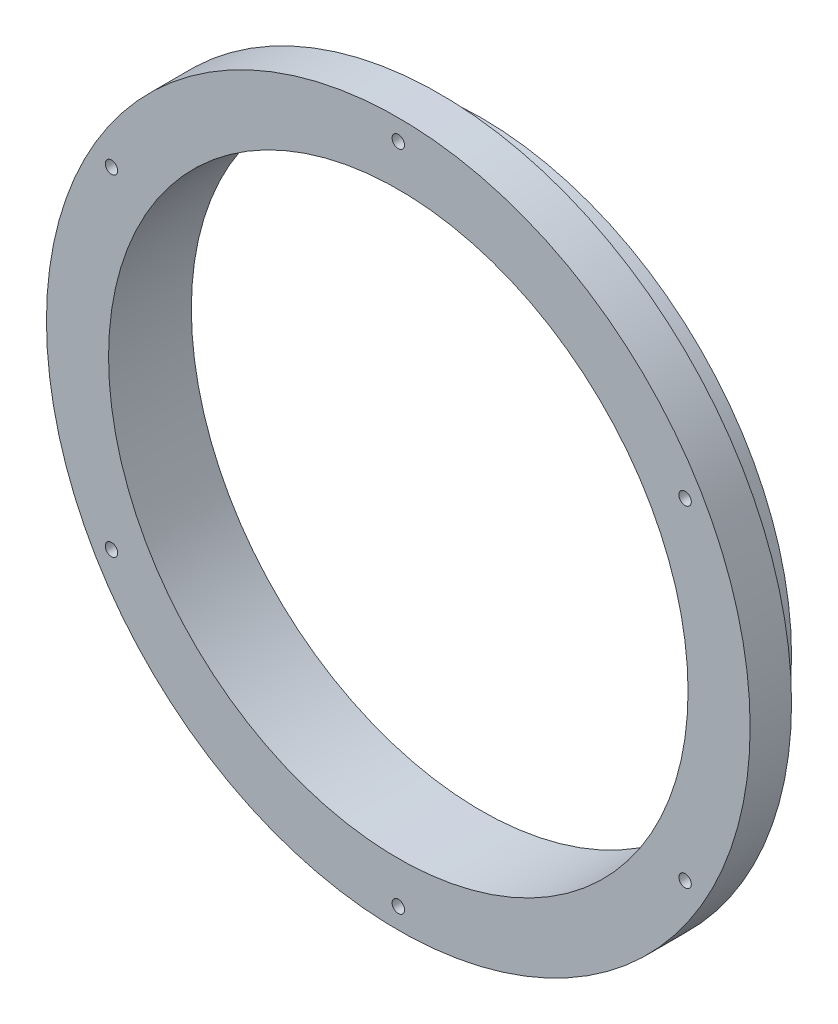
ISO-10303-21;
HEADER;
FILE_DESCRIPTION(('STEP AP214'),'2;1');
FILE_NAME('part.step','',(''),(''),'','','');
FILE_SCHEMA(('AUTOMOTIVE_DESIGN { 1 0 10303 214 1 1 1 1 }'));
ENDSEC;
DATA;
#1=APPLICATION_CONTEXT('core data for automotive mechanical design processes');
#2=APPLICATION_PROTOCOL_DEFINITION('international standard','automotive_design',2000,#1);
#3=PRODUCT_CONTEXT('',#1,'mechanical');
#4=PRODUCT('Part','Part','',(#3));
#5=PRODUCT_RELATED_PRODUCT_CATEGORY('part','',(#4));
#6=PRODUCT_DEFINITION_FORMATION('','',#4);
#7=PRODUCT_DEFINITION_CONTEXT('part definition',#1,'design');
#8=PRODUCT_DEFINITION('design','',#6,#7);
#9=PRODUCT_DEFINITION_SHAPE('','',#8);
#10=(LENGTH_UNIT() NAMED_UNIT(*) SI_UNIT(.MILLI.,.METRE.));
#11=(NAMED_UNIT(*) PLANE_ANGLE_UNIT() SI_UNIT($,.RADIAN.));
#12=(NAMED_UNIT(*) SI_UNIT($,.STERADIAN.) SOLID_ANGLE_UNIT());
#13=UNCERTAINTY_MEASURE_WITH_UNIT(LENGTH_MEASURE(1.E-05),#10,'distance_accuracy_value','');
#14=(GEOMETRIC_REPRESENTATION_CONTEXT(3) GLOBAL_UNCERTAINTY_ASSIGNED_CONTEXT((#13)) GLOBAL_UNIT_ASSIGNED_CONTEXT((#10,
#11,#12)) REPRESENTATION_CONTEXT('',''));
#15=CARTESIAN_POINT('',(0.,0.,0.));
#16=DIRECTION('',(0.,0.,1.));
#17=DIRECTION('',(1.,0.,0.));
#18=AXIS2_PLACEMENT_3D('',#15,#16,#17);
#19=CARTESIAN_POINT('',(0.,0.,10.));
#20=DIRECTION('',(0.,0.,1.));
#21=DIRECTION('',(1.,0.,0.));
#22=AXIS2_PLACEMENT_3D('',#19,#20,#21);
#23=PLANE('',#22);
#24=CARTESIAN_POINT('',(69.2820323027546,40.0000000000008,10.));
#25=DIRECTION('',(0.,0.,1.));
#26=DIRECTION('',(0.50000000000001,-0.866025403784433,0.));
#27=AXIS2_PLACEMENT_3D('',#24,#25,#26);
#28=CIRCLE('',#27,1.5);
#29=CARTESIAN_POINT('',(70.0320323027546,38.7009618943242,10.));
#30=VERTEX_POINT('',#29);
#31=EDGE_CURVE('E66',#30,#30,#28,.T.);
#32=ORIENTED_EDGE('',*,*,#31,.F.);
#33=EDGE_LOOP('',(#32));
#34=FACE_BOUND('',#33,.T.);
#35=CARTESIAN_POINT('',(69.2820323027555,-39.9999999999994,10.));
#36=DIRECTION('',(0.,0.,1.));
#37=DIRECTION('',(-0.499999999999992,-0.866025403784443,0.));
#38=AXIS2_PLACEMENT_3D('',#35,#36,#37);
#39=CIRCLE('',#38,1.5);
#40=CARTESIAN_POINT('',(68.5320323027555,-41.299038105676,10.));
#41=VERTEX_POINT('',#40);
#42=EDGE_CURVE('E60',#41,#41,#39,.T.);
#43=ORIENTED_EDGE('',*,*,#42,.F.);
#44=EDGE_LOOP('',(#43));
#45=FACE_BOUND('',#44,.T.);
#46=CARTESIAN_POINT('',(0.,-80.,10.));
#47=DIRECTION('',(0.,0.,1.));
#48=DIRECTION('',(-1.,0.,0.));
#49=AXIS2_PLACEMENT_3D('',#46,#47,#48);
#50=CIRCLE('',#49,1.5);
#51=CARTESIAN_POINT('',(-1.5,-80.,10.));
#52=VERTEX_POINT('',#51);
#53=EDGE_CURVE('E54',#52,#52,#50,.T.);
#54=ORIENTED_EDGE('',*,*,#53,.F.);
#55=EDGE_LOOP('',(#54));
#56=FACE_BOUND('',#55,.T.);
#57=CARTESIAN_POINT('',(-69.2820323027549,-40.0000000000003,10.));
#58=DIRECTION('',(0.,0.,1.));
#59=DIRECTION('',(-0.500000000000004,0.866025403784436,0.));
#60=AXIS2_PLACEMENT_3D('',#57,#58,#59);
#61=CIRCLE('',#60,1.5);
#62=CARTESIAN_POINT('',(-70.0320323027549,-38.7009618943237,10.));
#63=VERTEX_POINT('',#62);
#64=EDGE_CURVE('E47',#63,#63,#61,.T.);
#65=ORIENTED_EDGE('',*,*,#64,.F.);
#66=EDGE_LOOP('',(#65));
#67=FACE_BOUND('',#66,.T.);
#68=CARTESIAN_POINT('',(-69.2820323027552,39.9999999999998,10.));
#69=DIRECTION('',(0.,0.,1.));
#70=DIRECTION('',(0.499999999999998,0.86602540378444,0.));
#71=AXIS2_PLACEMENT_3D('',#68,#69,#70);
#72=CIRCLE('',#71,1.5);
#73=CARTESIAN_POINT('',(-68.5320323027552,41.2990381056765,10.));
#74=VERTEX_POINT('',#73);
#75=EDGE_CURVE('E72',#74,#74,#72,.T.);
#76=ORIENTED_EDGE('',*,*,#75,.F.);
#77=EDGE_LOOP('',(#76));
#78=FACE_BOUND('',#77,.T.);
#79=CARTESIAN_POINT('',(0.,80.,10.));
#80=DIRECTION('',(0.,0.,1.));
#81=DIRECTION('',(1.,0.,0.));
#82=AXIS2_PLACEMENT_3D('',#79,#80,#81);
#83=CIRCLE('',#82,1.5);
#84=CARTESIAN_POINT('',(1.5,80.,10.));
#85=VERTEX_POINT('',#84);
#86=EDGE_CURVE('E78',#85,#85,#83,.T.);
#87=ORIENTED_EDGE('',*,*,#86,.F.);
#88=EDGE_LOOP('',(#87));
#89=FACE_BOUND('',#88,.T.);
#90=CARTESIAN_POINT('',(0.,0.,10.));
#91=DIRECTION('',(0.,0.,1.));
#92=DIRECTION('',(1.,0.,0.));
#93=AXIS2_PLACEMENT_3D('',#90,#91,#92);
#94=CIRCLE('',#93,85.);
#95=CARTESIAN_POINT('',(85.,0.,10.));
#96=VERTEX_POINT('',#95);
#97=EDGE_CURVE('E38',#96,#96,#94,.T.);
#98=ORIENTED_EDGE('',*,*,#97,.T.);
#99=EDGE_LOOP('',(#98));
#100=FACE_BOUND('',#99,.T.);
#101=CARTESIAN_POINT('',(0.,0.,10.));
#102=DIRECTION('',(0.,0.,1.));
#103=DIRECTION('',(1.,0.,0.));
#104=AXIS2_PLACEMENT_3D('',#101,#102,#103);
#105=CIRCLE('',#104,70.);
#106=CARTESIAN_POINT('',(70.,0.,10.));
#107=VERTEX_POINT('',#106);
#108=EDGE_CURVE('E81',#107,#107,#105,.T.);
#109=ORIENTED_EDGE('',*,*,#108,.F.);
#110=EDGE_LOOP('',(#109));
#111=FACE_BOUND('',#110,.T.);
#112=ADVANCED_FACE('F30',(#34,#45,#56,#67,#78,#89,#100,#111),#23,.T.);
#113=CARTESIAN_POINT('',(0.,0.,0.));
#114=DIRECTION('',(0.,0.,1.));
#115=DIRECTION('',(1.,0.,0.));
#116=AXIS2_PLACEMENT_3D('',#113,#114,#115);
#117=PLANE('',#116);
#118=CARTESIAN_POINT('',(0.,0.,0.));
#119=DIRECTION('',(0.,0.,-1.));
#120=DIRECTION('',(-1.,0.,0.));
#121=AXIS2_PLACEMENT_3D('',#118,#119,#120);
#122=CIRCLE('',#121,75.);
#123=CARTESIAN_POINT('',(-75.,0.,0.));
#124=VERTEX_POINT('',#123);
#125=EDGE_CURVE('E10',#124,#124,#122,.T.);
#126=ORIENTED_EDGE('',*,*,#125,.F.);
#127=EDGE_LOOP('',(#126));
#128=FACE_BOUND('',#127,.T.);
#129=CARTESIAN_POINT('',(69.2820323027546,40.0000000000008,0.));
#130=DIRECTION('',(0.,0.,1.));
#131=DIRECTION('',(0.50000000000001,-0.866025403784433,0.));
#132=AXIS2_PLACEMENT_3D('',#129,#130,#131);
#133=CIRCLE('',#132,1.5);
#134=CARTESIAN_POINT('',(70.0320323027546,38.7009618943242,0.));
#135=VERTEX_POINT('',#134);
#136=EDGE_CURVE('E69',#135,#135,#133,.T.);
#137=ORIENTED_EDGE('',*,*,#136,.T.);
#138=EDGE_LOOP('',(#137));
#139=FACE_BOUND('',#138,.T.);
#140=CARTESIAN_POINT('',(69.2820323027555,-39.9999999999994,0.));
#141=DIRECTION('',(0.,0.,1.));
#142=DIRECTION('',(-0.499999999999992,-0.866025403784443,0.));
#143=AXIS2_PLACEMENT_3D('',#140,#141,#142);
#144=CIRCLE('',#143,1.5);
#145=CARTESIAN_POINT('',(68.5320323027555,-41.299038105676,0.));
#146=VERTEX_POINT('',#145);
#147=EDGE_CURVE('E63',#146,#146,#144,.T.);
#148=ORIENTED_EDGE('',*,*,#147,.T.);
#149=EDGE_LOOP('',(#148));
#150=FACE_BOUND('',#149,.T.);
#151=CARTESIAN_POINT('',(0.,-80.,0.));
#152=DIRECTION('',(0.,0.,1.));
#153=DIRECTION('',(-1.,0.,0.));
#154=AXIS2_PLACEMENT_3D('',#151,#152,#153);
#155=CIRCLE('',#154,1.5);
#156=CARTESIAN_POINT('',(-1.5,-80.,0.));
#157=VERTEX_POINT('',#156);
#158=EDGE_CURVE('E57',#157,#157,#155,.T.);
#159=ORIENTED_EDGE('',*,*,#158,.T.);
#160=EDGE_LOOP('',(#159));
#161=FACE_BOUND('',#160,.T.);
#162=CARTESIAN_POINT('',(-69.2820323027549,-40.0000000000003,0.));
#163=DIRECTION('',(0.,0.,1.));
#164=DIRECTION('',(-0.500000000000004,0.866025403784436,0.));
#165=AXIS2_PLACEMENT_3D('',#162,#163,#164);
#166=CIRCLE('',#165,1.5);
#167=CARTESIAN_POINT('',(-70.0320323027549,-38.7009618943237,0.));
#168=VERTEX_POINT('',#167);
#169=EDGE_CURVE('E51',#168,#168,#166,.T.);
#170=ORIENTED_EDGE('',*,*,#169,.T.);
#171=EDGE_LOOP('',(#170));
#172=FACE_BOUND('',#171,.T.);
#173=CARTESIAN_POINT('',(-69.2820323027552,39.9999999999998,0.));
#174=DIRECTION('',(0.,0.,1.));
#175=DIRECTION('',(0.499999999999998,0.86602540378444,0.));
#176=AXIS2_PLACEMENT_3D('',#173,#174,#175);
#177=CIRCLE('',#176,1.5);
#178=CARTESIAN_POINT('',(-68.5320323027552,41.2990381056765,0.));
#179=VERTEX_POINT('',#178);
#180=EDGE_CURVE('E50',#179,#179,#177,.T.);
#181=ORIENTED_EDGE('',*,*,#180,.T.);
#182=EDGE_LOOP('',(#181));
#183=FACE_BOUND('',#182,.T.);
#184=CARTESIAN_POINT('',(0.,80.,0.));
#185=DIRECTION('',(0.,0.,1.));
#186=DIRECTION('',(1.,0.,0.));
#187=AXIS2_PLACEMENT_3D('',#184,#185,#186);
#188=CIRCLE('',#187,1.5);
#189=CARTESIAN_POINT('',(1.5,80.,0.));
#190=VERTEX_POINT('',#189);
#191=EDGE_CURVE('E75',#190,#190,#188,.T.);
#192=ORIENTED_EDGE('',*,*,#191,.T.);
#193=EDGE_LOOP('',(#192));
#194=FACE_BOUND('',#193,.T.);
#195=CARTESIAN_POINT('',(0.,0.,0.));
#196=DIRECTION('',(0.,0.,1.));
#197=DIRECTION('',(1.,0.,0.));
#198=AXIS2_PLACEMENT_3D('',#195,#196,#197);
#199=CIRCLE('',#198,85.);
#200=CARTESIAN_POINT('',(85.,0.,0.));
#201=VERTEX_POINT('',#200);
#202=EDGE_CURVE('E34',#201,#201,#199,.T.);
#203=ORIENTED_EDGE('',*,*,#202,.F.);
#204=EDGE_LOOP('',(#203));
#205=FACE_BOUND('',#204,.T.);
#206=ADVANCED_FACE('F91',(#128,#139,#150,#161,#172,#183,#194,#205),#117,.F.);
#207=CARTESIAN_POINT('',(0.,0.,10.));
#208=DIRECTION('',(0.,0.,-1.));
#209=DIRECTION('',(-1.,0.,0.));
#210=AXIS2_PLACEMENT_3D('',#207,#208,#209);
#211=CYLINDRICAL_SURFACE('',#210,85.);
#212=ORIENTED_EDGE('',*,*,#97,.F.);
#213=EDGE_LOOP('',(#212));
#214=FACE_BOUND('',#213,.T.);
#215=ORIENTED_EDGE('',*,*,#202,.T.);
#216=EDGE_LOOP('',(#215));
#217=FACE_BOUND('',#216,.T.);
#218=ADVANCED_FACE('F32',(#214,#217),#211,.T.);
#219=CARTESIAN_POINT('',(0.,0.,10.));
#220=DIRECTION('',(0.,0.,-1.));
#221=DIRECTION('',(-1.,0.,0.));
#222=AXIS2_PLACEMENT_3D('',#219,#220,#221);
#223=CYLINDRICAL_SURFACE('',#222,70.);
#224=ORIENTED_EDGE('',*,*,#108,.T.);
#225=EDGE_LOOP('',(#224));
#226=FACE_BOUND('',#225,.T.);
#227=CARTESIAN_POINT('',(0.,0.,-10.));
#228=DIRECTION('',(0.,0.,-1.));
#229=DIRECTION('',(-1.,0.,0.));
#230=AXIS2_PLACEMENT_3D('',#227,#228,#229);
#231=CIRCLE('',#230,70.);
#232=CARTESIAN_POINT('',(-70.,0.,-10.));
#233=VERTEX_POINT('',#232);
#234=EDGE_CURVE('E144',#233,#233,#231,.T.);
#235=ORIENTED_EDGE('',*,*,#234,.T.);
#236=EDGE_LOOP('',(#235));
#237=FACE_BOUND('',#236,.T.);
#238=ADVANCED_FACE('F98',(#226,#237),#223,.F.);
#239=CARTESIAN_POINT('',(0.,80.,10.));
#240=DIRECTION('',(0.,0.,-1.));
#241=DIRECTION('',(-1.,0.,0.));
#242=AXIS2_PLACEMENT_3D('',#239,#240,#241);
#243=CYLINDRICAL_SURFACE('',#242,1.5);
#244=ORIENTED_EDGE('',*,*,#86,.T.);
#245=EDGE_LOOP('',(#244));
#246=FACE_BOUND('',#245,.T.);
#247=ORIENTED_EDGE('',*,*,#191,.F.);
#248=EDGE_LOOP('',(#247));
#249=FACE_BOUND('',#248,.T.);
#250=ADVANCED_FACE('F106',(#246,#249),#243,.F.);
#251=CARTESIAN_POINT('',(-69.2820323027552,39.9999999999998,10.));
#252=DIRECTION('',(0.,0.,-1.));
#253=DIRECTION('',(-1.,0.,0.));
#254=AXIS2_PLACEMENT_3D('',#251,#252,#253);
#255=CYLINDRICAL_SURFACE('',#254,1.5);
#256=ORIENTED_EDGE('',*,*,#75,.T.);
#257=EDGE_LOOP('',(#256));
#258=FACE_BOUND('',#257,.T.);
#259=ORIENTED_EDGE('',*,*,#180,.F.);
#260=EDGE_LOOP('',(#259));
#261=FACE_BOUND('',#260,.T.);
#262=ADVANCED_FACE('F109',(#258,#261),#255,.F.);
#263=CARTESIAN_POINT('',(-69.2820323027549,-40.0000000000003,10.));
#264=DIRECTION('',(0.,0.,-1.));
#265=DIRECTION('',(-1.,0.,0.));
#266=AXIS2_PLACEMENT_3D('',#263,#264,#265);
#267=CYLINDRICAL_SURFACE('',#266,1.5);
#268=ORIENTED_EDGE('',*,*,#64,.T.);
#269=EDGE_LOOP('',(#268));
#270=FACE_BOUND('',#269,.T.);
#271=ORIENTED_EDGE('',*,*,#169,.F.);
#272=EDGE_LOOP('',(#271));
#273=FACE_BOUND('',#272,.T.);
#274=ADVANCED_FACE('F113',(#270,#273),#267,.F.);
#275=CARTESIAN_POINT('',(0.,-80.,10.));
#276=DIRECTION('',(0.,0.,-1.));
#277=DIRECTION('',(-1.,0.,0.));
#278=AXIS2_PLACEMENT_3D('',#275,#276,#277);
#279=CYLINDRICAL_SURFACE('',#278,1.5);
#280=ORIENTED_EDGE('',*,*,#53,.T.);
#281=EDGE_LOOP('',(#280));
#282=FACE_BOUND('',#281,.T.);
#283=ORIENTED_EDGE('',*,*,#158,.F.);
#284=EDGE_LOOP('',(#283));
#285=FACE_BOUND('',#284,.T.);
#286=ADVANCED_FACE('F123',(#282,#285),#279,.F.);
#287=CARTESIAN_POINT('',(69.2820323027555,-39.9999999999994,10.));
#288=DIRECTION('',(0.,0.,-1.));
#289=DIRECTION('',(-1.,0.,0.));
#290=AXIS2_PLACEMENT_3D('',#287,#288,#289);
#291=CYLINDRICAL_SURFACE('',#290,1.5);
#292=ORIENTED_EDGE('',*,*,#42,.T.);
#293=EDGE_LOOP('',(#292));
#294=FACE_BOUND('',#293,.T.);
#295=ORIENTED_EDGE('',*,*,#147,.F.);
#296=EDGE_LOOP('',(#295));
#297=FACE_BOUND('',#296,.T.);
#298=ADVANCED_FACE('F119',(#294,#297),#291,.F.);
#299=CARTESIAN_POINT('',(69.2820323027546,40.0000000000008,10.));
#300=DIRECTION('',(0.,0.,-1.));
#301=DIRECTION('',(-1.,0.,0.));
#302=AXIS2_PLACEMENT_3D('',#299,#300,#301);
#303=CYLINDRICAL_SURFACE('',#302,1.5);
#304=ORIENTED_EDGE('',*,*,#31,.T.);
#305=EDGE_LOOP('',(#304));
#306=FACE_BOUND('',#305,.T.);
#307=ORIENTED_EDGE('',*,*,#136,.F.);
#308=EDGE_LOOP('',(#307));
#309=FACE_BOUND('',#308,.T.);
#310=ADVANCED_FACE('F115',(#306,#309),#303,.F.);
#311=CARTESIAN_POINT('',(0.,0.,-10.));
#312=DIRECTION('',(0.,0.,-1.));
#313=DIRECTION('',(-1.,0.,0.));
#314=AXIS2_PLACEMENT_3D('',#311,#312,#313);
#315=PLANE('',#314);
#316=CARTESIAN_POINT('',(0.,0.,-10.));
#317=DIRECTION('',(0.,0.,-1.));
#318=DIRECTION('',(-1.,0.,0.));
#319=AXIS2_PLACEMENT_3D('',#316,#317,#318);
#320=CIRCLE('',#319,75.);
#321=CARTESIAN_POINT('',(-75.,0.,-10.));
#322=VERTEX_POINT('',#321);
#323=EDGE_CURVE('E45',#322,#322,#320,.T.);
#324=ORIENTED_EDGE('',*,*,#323,.T.);
#325=EDGE_LOOP('',(#324));
#326=FACE_BOUND('',#325,.T.);
#327=ORIENTED_EDGE('',*,*,#234,.F.);
#328=EDGE_LOOP('',(#327));
#329=FACE_BOUND('',#328,.T.);
#330=ADVANCED_FACE('F118',(#326,#329),#315,.T.);
#331=CARTESIAN_POINT('',(0.,0.,-10.));
#332=DIRECTION('',(0.,0.,1.));
#333=DIRECTION('',(1.,0.,0.));
#334=AXIS2_PLACEMENT_3D('',#331,#332,#333);
#335=CYLINDRICAL_SURFACE('',#334,75.);
#336=ORIENTED_EDGE('',*,*,#323,.F.);
#337=EDGE_LOOP('',(#336));
#338=FACE_BOUND('',#337,.T.);
#339=ORIENTED_EDGE('',*,*,#125,.T.);
#340=EDGE_LOOP('',(#339));
#341=FACE_BOUND('',#340,.T.);
#342=ADVANCED_FACE('F131',(#338,#341),#335,.T.);
#343=CLOSED_SHELL('',(#112,#206,#218,#238,#250,#262,#274,#286,#298,#310,#330,#342));
#344=MANIFOLD_SOLID_BREP('B2',#343);
#345=ADVANCED_BREP_SHAPE_REPRESENTATION('',(#18,#344),#14);
#346=SHAPE_DEFINITION_REPRESENTATION(#9,#345);
ENDSEC;
END-ISO-10303-21;
